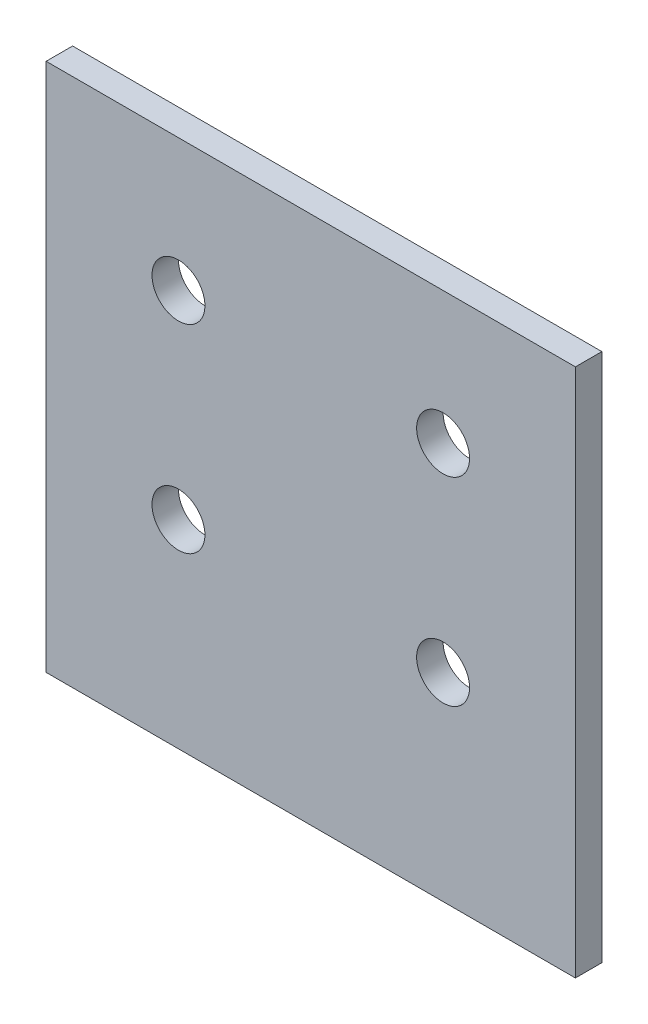
ISO-10303-21;
HEADER;
FILE_DESCRIPTION(('STEP AP214'),'2;1');
FILE_NAME('part.step','',(''),(''),'','','');
FILE_SCHEMA(('AUTOMOTIVE_DESIGN { 1 0 10303 214 1 1 1 1 }'));
ENDSEC;
DATA;
#1=APPLICATION_CONTEXT('core data for automotive mechanical design processes');
#2=APPLICATION_PROTOCOL_DEFINITION('international standard','automotive_design',2000,#1);
#3=PRODUCT_CONTEXT('',#1,'mechanical');
#4=PRODUCT('Part','Part','',(#3));
#5=PRODUCT_RELATED_PRODUCT_CATEGORY('part','',(#4));
#6=PRODUCT_DEFINITION_FORMATION('','',#4);
#7=PRODUCT_DEFINITION_CONTEXT('part definition',#1,'design');
#8=PRODUCT_DEFINITION('design','',#6,#7);
#9=PRODUCT_DEFINITION_SHAPE('','',#8);
#10=(LENGTH_UNIT() NAMED_UNIT(*) SI_UNIT(.MILLI.,.METRE.));
#11=(NAMED_UNIT(*) PLANE_ANGLE_UNIT() SI_UNIT($,.RADIAN.));
#12=(NAMED_UNIT(*) SI_UNIT($,.STERADIAN.) SOLID_ANGLE_UNIT());
#13=UNCERTAINTY_MEASURE_WITH_UNIT(LENGTH_MEASURE(1.E-05),#10,'distance_accuracy_value','');
#14=(GEOMETRIC_REPRESENTATION_CONTEXT(3) GLOBAL_UNCERTAINTY_ASSIGNED_CONTEXT((#13)) GLOBAL_UNIT_ASSIGNED_CONTEXT((#10,
#11,#12)) REPRESENTATION_CONTEXT('',''));
#15=CARTESIAN_POINT('',(0.,0.,0.));
#16=DIRECTION('',(0.,0.,1.));
#17=DIRECTION('',(1.,0.,0.));
#18=AXIS2_PLACEMENT_3D('',#15,#16,#17);
#19=CARTESIAN_POINT('',(0.,0.,2.));
#20=DIRECTION('',(0.,0.,-1.));
#21=DIRECTION('',(-1.,0.,0.));
#22=AXIS2_PLACEMENT_3D('',#19,#20,#21);
#23=PLANE('',#22);
#24=DIRECTION('',(0.,-1.,0.));
#25=VECTOR('',#24,1.);
#26=CARTESIAN_POINT('',(0.,0.,2.));
#27=LINE('',#26,#25);
#28=CARTESIAN_POINT('',(0.,40.,2.));
#29=VERTEX_POINT('',#28);
#30=CARTESIAN_POINT('',(0.,0.,2.));
#31=VERTEX_POINT('',#30);
#32=EDGE_CURVE('E85',#29,#31,#27,.T.);
#33=ORIENTED_EDGE('',*,*,#32,.T.);
#34=DIRECTION('',(1.,0.,0.));
#35=VECTOR('',#34,1.);
#36=CARTESIAN_POINT('',(0.,0.,2.));
#37=LINE('',#36,#35);
#38=CARTESIAN_POINT('',(40.,0.,2.));
#39=VERTEX_POINT('',#38);
#40=EDGE_CURVE('E80',#31,#39,#37,.T.);
#41=ORIENTED_EDGE('',*,*,#40,.T.);
#42=DIRECTION('',(0.,1.,0.));
#43=VECTOR('',#42,1.);
#44=CARTESIAN_POINT('',(40.,0.,2.));
#45=LINE('',#44,#43);
#46=CARTESIAN_POINT('',(40.,40.,2.));
#47=VERTEX_POINT('',#46);
#48=EDGE_CURVE('E83',#39,#47,#45,.T.);
#49=ORIENTED_EDGE('',*,*,#48,.T.);
#50=DIRECTION('',(-1.,0.,0.));
#51=VECTOR('',#50,1.);
#52=CARTESIAN_POINT('',(0.,40.,2.));
#53=LINE('',#52,#51);
#54=EDGE_CURVE('E50',#47,#29,#53,.T.);
#55=ORIENTED_EDGE('',*,*,#54,.T.);
#56=EDGE_LOOP('',(#33,#41,#49,#55));
#57=FACE_BOUND('',#56,.T.);
#58=CARTESIAN_POINT('',(10.,30.,2.));
#59=DIRECTION('',(0.,0.,1.));
#60=DIRECTION('',(1.,0.,0.));
#61=AXIS2_PLACEMENT_3D('',#58,#59,#60);
#62=CIRCLE('',#61,2.);
#63=CARTESIAN_POINT('',(12.,30.,2.));
#64=VERTEX_POINT('',#63);
#65=EDGE_CURVE('E100',#64,#64,#62,.T.);
#66=ORIENTED_EDGE('',*,*,#65,.F.);
#67=EDGE_LOOP('',(#66));
#68=FACE_BOUND('',#67,.T.);
#69=CARTESIAN_POINT('',(10.,15.,2.));
#70=DIRECTION('',(0.,0.,1.));
#71=DIRECTION('',(1.,0.,0.));
#72=AXIS2_PLACEMENT_3D('',#69,#70,#71);
#73=CIRCLE('',#72,2.);
#74=CARTESIAN_POINT('',(12.,15.,2.));
#75=VERTEX_POINT('',#74);
#76=EDGE_CURVE('E115',#75,#75,#73,.T.);
#77=ORIENTED_EDGE('',*,*,#76,.F.);
#78=EDGE_LOOP('',(#77));
#79=FACE_BOUND('',#78,.T.);
#80=CARTESIAN_POINT('',(30.,30.,2.));
#81=DIRECTION('',(0.,0.,1.));
#82=DIRECTION('',(1.,0.,0.));
#83=AXIS2_PLACEMENT_3D('',#80,#81,#82);
#84=CIRCLE('',#83,2.);
#85=CARTESIAN_POINT('',(32.,30.,2.));
#86=VERTEX_POINT('',#85);
#87=EDGE_CURVE('E121',#86,#86,#84,.T.);
#88=ORIENTED_EDGE('',*,*,#87,.F.);
#89=EDGE_LOOP('',(#88));
#90=FACE_BOUND('',#89,.T.);
#91=CARTESIAN_POINT('',(30.,15.,2.));
#92=DIRECTION('',(0.,0.,1.));
#93=DIRECTION('',(1.,0.,0.));
#94=AXIS2_PLACEMENT_3D('',#91,#92,#93);
#95=CIRCLE('',#94,2.);
#96=CARTESIAN_POINT('',(32.,15.,2.));
#97=VERTEX_POINT('',#96);
#98=EDGE_CURVE('E127',#97,#97,#95,.T.);
#99=ORIENTED_EDGE('',*,*,#98,.F.);
#100=EDGE_LOOP('',(#99));
#101=FACE_BOUND('',#100,.T.);
#102=ADVANCED_FACE('F33',(#57,#68,#79,#90,#101),#23,.F.);
#103=CARTESIAN_POINT('',(0.,0.,0.));
#104=DIRECTION('',(0.,0.,-1.));
#105=DIRECTION('',(-1.,0.,0.));
#106=AXIS2_PLACEMENT_3D('',#103,#104,#105);
#107=PLANE('',#106);
#108=CARTESIAN_POINT('',(30.,30.,0.));
#109=DIRECTION('',(0.,0.,1.));
#110=DIRECTION('',(1.,0.,0.));
#111=AXIS2_PLACEMENT_3D('',#108,#109,#110);
#112=CIRCLE('',#111,2.);
#113=CARTESIAN_POINT('',(32.,30.,0.));
#114=VERTEX_POINT('',#113);
#115=EDGE_CURVE('E124',#114,#114,#112,.T.);
#116=ORIENTED_EDGE('',*,*,#115,.T.);
#117=EDGE_LOOP('',(#116));
#118=FACE_BOUND('',#117,.T.);
#119=CARTESIAN_POINT('',(10.,30.,0.));
#120=DIRECTION('',(0.,0.,1.));
#121=DIRECTION('',(1.,0.,0.));
#122=AXIS2_PLACEMENT_3D('',#119,#120,#121);
#123=CIRCLE('',#122,2.);
#124=CARTESIAN_POINT('',(12.,30.,0.));
#125=VERTEX_POINT('',#124);
#126=EDGE_CURVE('E112',#125,#125,#123,.T.);
#127=ORIENTED_EDGE('',*,*,#126,.T.);
#128=EDGE_LOOP('',(#127));
#129=FACE_BOUND('',#128,.T.);
#130=DIRECTION('',(0.,-1.,0.));
#131=VECTOR('',#130,1.);
#132=CARTESIAN_POINT('',(0.,0.,0.));
#133=LINE('',#132,#131);
#134=CARTESIAN_POINT('',(0.,40.,0.));
#135=VERTEX_POINT('',#134);
#136=CARTESIAN_POINT('',(0.,0.,0.));
#137=VERTEX_POINT('',#136);
#138=EDGE_CURVE('E97',#135,#137,#133,.T.);
#139=ORIENTED_EDGE('',*,*,#138,.F.);
#140=DIRECTION('',(-1.,0.,0.));
#141=VECTOR('',#140,1.);
#142=CARTESIAN_POINT('',(0.,40.,0.));
#143=LINE('',#142,#141);
#144=CARTESIAN_POINT('',(40.,40.,0.));
#145=VERTEX_POINT('',#144);
#146=EDGE_CURVE('E73',#145,#135,#143,.T.);
#147=ORIENTED_EDGE('',*,*,#146,.F.);
#148=DIRECTION('',(0.,1.,0.));
#149=VECTOR('',#148,1.);
#150=CARTESIAN_POINT('',(40.,0.,0.));
#151=LINE('',#150,#149);
#152=CARTESIAN_POINT('',(40.,0.,0.));
#153=VERTEX_POINT('',#152);
#154=EDGE_CURVE('E67',#153,#145,#151,.T.);
#155=ORIENTED_EDGE('',*,*,#154,.F.);
#156=DIRECTION('',(1.,0.,0.));
#157=VECTOR('',#156,1.);
#158=CARTESIAN_POINT('',(0.,0.,0.));
#159=LINE('',#158,#157);
#160=EDGE_CURVE('E89',#137,#153,#159,.T.);
#161=ORIENTED_EDGE('',*,*,#160,.F.);
#162=EDGE_LOOP('',(#139,#147,#155,#161));
#163=FACE_BOUND('',#162,.T.);
#164=CARTESIAN_POINT('',(10.,15.,0.));
#165=DIRECTION('',(0.,0.,1.));
#166=DIRECTION('',(1.,0.,0.));
#167=AXIS2_PLACEMENT_3D('',#164,#165,#166);
#168=CIRCLE('',#167,2.);
#169=CARTESIAN_POINT('',(12.,15.,0.));
#170=VERTEX_POINT('',#169);
#171=EDGE_CURVE('E118',#170,#170,#168,.T.);
#172=ORIENTED_EDGE('',*,*,#171,.T.);
#173=EDGE_LOOP('',(#172));
#174=FACE_BOUND('',#173,.T.);
#175=CARTESIAN_POINT('',(30.,15.,0.));
#176=DIRECTION('',(0.,0.,1.));
#177=DIRECTION('',(1.,0.,0.));
#178=AXIS2_PLACEMENT_3D('',#175,#176,#177);
#179=CIRCLE('',#178,2.);
#180=CARTESIAN_POINT('',(32.,15.,0.));
#181=VERTEX_POINT('',#180);
#182=EDGE_CURVE('E130',#181,#181,#179,.T.);
#183=ORIENTED_EDGE('',*,*,#182,.T.);
#184=EDGE_LOOP('',(#183));
#185=FACE_BOUND('',#184,.T.);
#186=ADVANCED_FACE('F108',(#118,#129,#163,#174,#185),#107,.T.);
#187=CARTESIAN_POINT('',(0.,0.,2.));
#188=DIRECTION('',(1.,0.,0.));
#189=DIRECTION('',(0.,0.,-1.));
#190=AXIS2_PLACEMENT_3D('',#187,#188,#189);
#191=PLANE('',#190);
#192=ORIENTED_EDGE('',*,*,#138,.T.);
#193=DIRECTION('',(0.,0.,-1.));
#194=VECTOR('',#193,1.);
#195=CARTESIAN_POINT('',(0.,0.,2.));
#196=LINE('',#195,#194);
#197=EDGE_CURVE('E11',#31,#137,#196,.T.);
#198=ORIENTED_EDGE('',*,*,#197,.F.);
#199=ORIENTED_EDGE('',*,*,#32,.F.);
#200=DIRECTION('',(0.,0.,-1.));
#201=VECTOR('',#200,1.);
#202=CARTESIAN_POINT('',(0.,40.,2.));
#203=LINE('',#202,#201);
#204=EDGE_CURVE('E93',#29,#135,#203,.T.);
#205=ORIENTED_EDGE('',*,*,#204,.T.);
#206=EDGE_LOOP('',(#192,#198,#199,#205));
#207=FACE_BOUND('',#206,.T.);
#208=ADVANCED_FACE('F35',(#207),#191,.F.);
#209=CARTESIAN_POINT('',(0.,0.,2.));
#210=DIRECTION('',(0.,1.,0.));
#211=DIRECTION('',(0.,0.,1.));
#212=AXIS2_PLACEMENT_3D('',#209,#210,#211);
#213=PLANE('',#212);
#214=ORIENTED_EDGE('',*,*,#160,.T.);
#215=DIRECTION('',(0.,0.,-1.));
#216=VECTOR('',#215,1.);
#217=CARTESIAN_POINT('',(40.,0.,2.));
#218=LINE('',#217,#216);
#219=EDGE_CURVE('E42',#39,#153,#218,.T.);
#220=ORIENTED_EDGE('',*,*,#219,.F.);
#221=ORIENTED_EDGE('',*,*,#40,.F.);
#222=ORIENTED_EDGE('',*,*,#197,.T.);
#223=EDGE_LOOP('',(#214,#220,#221,#222));
#224=FACE_BOUND('',#223,.T.);
#225=ADVANCED_FACE('F88',(#224),#213,.F.);
#226=CARTESIAN_POINT('',(40.,0.,2.));
#227=DIRECTION('',(-1.,0.,0.));
#228=DIRECTION('',(0.,0.,1.));
#229=AXIS2_PLACEMENT_3D('',#226,#227,#228);
#230=PLANE('',#229);
#231=ORIENTED_EDGE('',*,*,#154,.T.);
#232=DIRECTION('',(0.,0.,-1.));
#233=VECTOR('',#232,1.);
#234=CARTESIAN_POINT('',(40.,40.,2.));
#235=LINE('',#234,#233);
#236=EDGE_CURVE('E90',#47,#145,#235,.T.);
#237=ORIENTED_EDGE('',*,*,#236,.F.);
#238=ORIENTED_EDGE('',*,*,#48,.F.);
#239=ORIENTED_EDGE('',*,*,#219,.T.);
#240=EDGE_LOOP('',(#231,#237,#238,#239));
#241=FACE_BOUND('',#240,.T.);
#242=ADVANCED_FACE('F91',(#241),#230,.F.);
#243=CARTESIAN_POINT('',(0.,40.,2.));
#244=DIRECTION('',(0.,-1.,0.));
#245=DIRECTION('',(0.,0.,-1.));
#246=AXIS2_PLACEMENT_3D('',#243,#244,#245);
#247=PLANE('',#246);
#248=ORIENTED_EDGE('',*,*,#146,.T.);
#249=ORIENTED_EDGE('',*,*,#204,.F.);
#250=ORIENTED_EDGE('',*,*,#54,.F.);
#251=ORIENTED_EDGE('',*,*,#236,.T.);
#252=EDGE_LOOP('',(#248,#249,#250,#251));
#253=FACE_BOUND('',#252,.T.);
#254=ADVANCED_FACE('F105',(#253),#247,.F.);
#255=CARTESIAN_POINT('',(10.,30.,2.));
#256=DIRECTION('',(0.,0.,-1.));
#257=DIRECTION('',(-1.,0.,0.));
#258=AXIS2_PLACEMENT_3D('',#255,#256,#257);
#259=CYLINDRICAL_SURFACE('',#258,2.);
#260=ORIENTED_EDGE('',*,*,#65,.T.);
#261=EDGE_LOOP('',(#260));
#262=FACE_BOUND('',#261,.T.);
#263=ORIENTED_EDGE('',*,*,#126,.F.);
#264=EDGE_LOOP('',(#263));
#265=FACE_BOUND('',#264,.T.);
#266=ADVANCED_FACE('F147',(#262,#265),#259,.F.);
#267=CARTESIAN_POINT('',(10.,15.,2.));
#268=DIRECTION('',(0.,0.,-1.));
#269=DIRECTION('',(-1.,0.,0.));
#270=AXIS2_PLACEMENT_3D('',#267,#268,#269);
#271=CYLINDRICAL_SURFACE('',#270,2.);
#272=ORIENTED_EDGE('',*,*,#76,.T.);
#273=EDGE_LOOP('',(#272));
#274=FACE_BOUND('',#273,.T.);
#275=ORIENTED_EDGE('',*,*,#171,.F.);
#276=EDGE_LOOP('',(#275));
#277=FACE_BOUND('',#276,.T.);
#278=ADVANCED_FACE('F193',(#274,#277),#271,.F.);
#279=CARTESIAN_POINT('',(30.,30.,2.));
#280=DIRECTION('',(0.,0.,-1.));
#281=DIRECTION('',(-1.,0.,0.));
#282=AXIS2_PLACEMENT_3D('',#279,#280,#281);
#283=CYLINDRICAL_SURFACE('',#282,2.);
#284=ORIENTED_EDGE('',*,*,#87,.T.);
#285=EDGE_LOOP('',(#284));
#286=FACE_BOUND('',#285,.T.);
#287=ORIENTED_EDGE('',*,*,#115,.F.);
#288=EDGE_LOOP('',(#287));
#289=FACE_BOUND('',#288,.T.);
#290=ADVANCED_FACE('F201',(#286,#289),#283,.F.);
#291=CARTESIAN_POINT('',(30.,15.,2.));
#292=DIRECTION('',(0.,0.,-1.));
#293=DIRECTION('',(-1.,0.,0.));
#294=AXIS2_PLACEMENT_3D('',#291,#292,#293);
#295=CYLINDRICAL_SURFACE('',#294,2.);
#296=ORIENTED_EDGE('',*,*,#98,.T.);
#297=EDGE_LOOP('',(#296));
#298=FACE_BOUND('',#297,.T.);
#299=ORIENTED_EDGE('',*,*,#182,.F.);
#300=EDGE_LOOP('',(#299));
#301=FACE_BOUND('',#300,.T.);
#302=ADVANCED_FACE('F136',(#298,#301),#295,.F.);
#303=CLOSED_SHELL('',(#102,#186,#208,#225,#242,#254,#266,#278,#290,#302));
#304=MANIFOLD_SOLID_BREP('B2',#303);
#305=ADVANCED_BREP_SHAPE_REPRESENTATION('',(#18,#304),#14);
#306=SHAPE_DEFINITION_REPRESENTATION(#9,#305);
ENDSEC;
END-ISO-10303-21;
